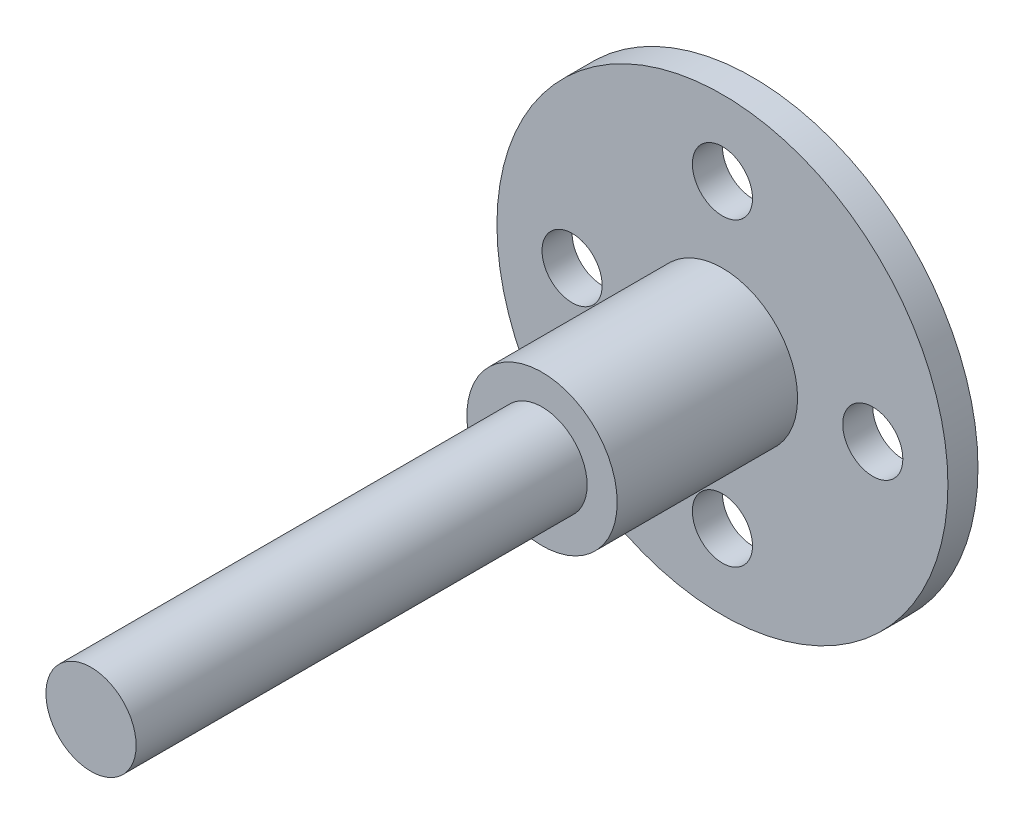
ISO-10303-21;
HEADER;
FILE_DESCRIPTION(('STEP AP214'),'2;1');
FILE_NAME('part.step','',(''),(''),'','','');
FILE_SCHEMA(('AUTOMOTIVE_DESIGN { 1 0 10303 214 1 1 1 1 }'));
ENDSEC;
DATA;
#1=APPLICATION_CONTEXT('core data for automotive mechanical design processes');
#2=APPLICATION_PROTOCOL_DEFINITION('international standard','automotive_design',2000,#1);
#3=PRODUCT_CONTEXT('',#1,'mechanical');
#4=PRODUCT('Part','Part','',(#3));
#5=PRODUCT_RELATED_PRODUCT_CATEGORY('part','',(#4));
#6=PRODUCT_DEFINITION_FORMATION('','',#4);
#7=PRODUCT_DEFINITION_CONTEXT('part definition',#1,'design');
#8=PRODUCT_DEFINITION('design','',#6,#7);
#9=PRODUCT_DEFINITION_SHAPE('','',#8);
#10=(LENGTH_UNIT() NAMED_UNIT(*) SI_UNIT(.MILLI.,.METRE.));
#11=(NAMED_UNIT(*) PLANE_ANGLE_UNIT() SI_UNIT($,.RADIAN.));
#12=(NAMED_UNIT(*) SI_UNIT($,.STERADIAN.) SOLID_ANGLE_UNIT());
#13=UNCERTAINTY_MEASURE_WITH_UNIT(LENGTH_MEASURE(1.E-05),#10,'distance_accuracy_value','');
#14=(GEOMETRIC_REPRESENTATION_CONTEXT(3) GLOBAL_UNCERTAINTY_ASSIGNED_CONTEXT((#13)) GLOBAL_UNIT_ASSIGNED_CONTEXT((#10,
#11,#12)) REPRESENTATION_CONTEXT('',''));
#15=CARTESIAN_POINT('',(0.,0.,0.));
#16=DIRECTION('',(0.,0.,1.));
#17=DIRECTION('',(1.,0.,0.));
#18=AXIS2_PLACEMENT_3D('',#15,#16,#17);
#19=CARTESIAN_POINT('',(0.,0.,2.));
#20=DIRECTION('',(0.,0.,-1.));
#21=DIRECTION('',(-1.,0.,0.));
#22=AXIS2_PLACEMENT_3D('',#19,#20,#21);
#23=CYLINDRICAL_SURFACE('',#22,15.);
#24=CARTESIAN_POINT('',(0.,0.,2.));
#25=DIRECTION('',(0.,0.,1.));
#26=DIRECTION('',(1.,0.,0.));
#27=AXIS2_PLACEMENT_3D('',#24,#25,#26);
#28=CIRCLE('',#27,15.);
#29=CARTESIAN_POINT('',(15.,0.,2.));
#30=VERTEX_POINT('',#29);
#31=EDGE_CURVE('E10',#30,#30,#28,.T.);
#32=ORIENTED_EDGE('',*,*,#31,.F.);
#33=EDGE_LOOP('',(#32));
#34=FACE_BOUND('',#33,.T.);
#35=CARTESIAN_POINT('',(0.,0.,0.));
#36=DIRECTION('',(0.,0.,1.));
#37=DIRECTION('',(1.,0.,0.));
#38=AXIS2_PLACEMENT_3D('',#35,#36,#37);
#39=CIRCLE('',#38,15.);
#40=CARTESIAN_POINT('',(15.,0.,0.));
#41=VERTEX_POINT('',#40);
#42=EDGE_CURVE('E38',#41,#41,#39,.T.);
#43=ORIENTED_EDGE('',*,*,#42,.T.);
#44=EDGE_LOOP('',(#43));
#45=FACE_BOUND('',#44,.T.);
#46=ADVANCED_FACE('F31',(#34,#45),#23,.T.);
#47=CARTESIAN_POINT('',(0.,0.,2.));
#48=DIRECTION('',(0.,0.,1.));
#49=DIRECTION('',(1.,0.,0.));
#50=AXIS2_PLACEMENT_3D('',#47,#48,#49);
#51=PLANE('',#50);
#52=CARTESIAN_POINT('',(10.0000000000003,2.82992447504893E-13,2.));
#53=DIRECTION('',(0.,0.,1.));
#54=DIRECTION('',(1.,0.,0.));
#55=AXIS2_PLACEMENT_3D('',#52,#53,#54);
#56=CIRCLE('',#55,2.00000000000022);
#57=CARTESIAN_POINT('',(12.0000000000005,2.82992447504893E-13,2.));
#58=VERTEX_POINT('',#57);
#59=EDGE_CURVE('E56',#58,#58,#56,.T.);
#60=ORIENTED_EDGE('',*,*,#59,.F.);
#61=EDGE_LOOP('',(#60));
#62=FACE_BOUND('',#61,.T.);
#63=CARTESIAN_POINT('',(5.65984895009786E-13,-10.,2.));
#64=DIRECTION('',(0.,0.,1.));
#65=DIRECTION('',(1.,0.,0.));
#66=AXIS2_PLACEMENT_3D('',#63,#64,#65);
#67=CIRCLE('',#66,2.00000000000061);
#68=CARTESIAN_POINT('',(2.00000000000117,-10.,2.));
#69=VERTEX_POINT('',#68);
#70=EDGE_CURVE('E128',#69,#69,#67,.T.);
#71=ORIENTED_EDGE('',*,*,#70,.F.);
#72=EDGE_LOOP('',(#71));
#73=FACE_BOUND('',#72,.T.);
#74=CARTESIAN_POINT('',(-9.99999999999972,-2.8421709430404E-13,2.));
#75=DIRECTION('',(0.,0.,1.));
#76=DIRECTION('',(1.,0.,0.));
#77=AXIS2_PLACEMENT_3D('',#74,#75,#76);
#78=CIRCLE('',#77,2.00000000000045);
#79=CARTESIAN_POINT('',(-7.99999999999926,-2.8421709430404E-13,2.));
#80=VERTEX_POINT('',#79);
#81=EDGE_CURVE('E68',#80,#80,#78,.T.);
#82=ORIENTED_EDGE('',*,*,#81,.F.);
#83=EDGE_LOOP('',(#82));
#84=FACE_BOUND('',#83,.T.);
#85=CARTESIAN_POINT('',(0.,10.,2.));
#86=DIRECTION('',(0.,0.,1.));
#87=DIRECTION('',(1.,0.,0.));
#88=AXIS2_PLACEMENT_3D('',#85,#86,#87);
#89=CIRCLE('',#88,2.);
#90=CARTESIAN_POINT('',(2.,10.,2.));
#91=VERTEX_POINT('',#90);
#92=EDGE_CURVE('E52',#91,#91,#89,.T.);
#93=ORIENTED_EDGE('',*,*,#92,.F.);
#94=EDGE_LOOP('',(#93));
#95=FACE_BOUND('',#94,.T.);
#96=CARTESIAN_POINT('',(0.,0.,2.));
#97=DIRECTION('',(0.,0.,1.));
#98=DIRECTION('',(1.,0.,0.));
#99=AXIS2_PLACEMENT_3D('',#96,#97,#98);
#100=CIRCLE('',#99,5.);
#101=CARTESIAN_POINT('',(5.,0.,2.));
#102=VERTEX_POINT('',#101);
#103=EDGE_CURVE('E46',#102,#102,#100,.T.);
#104=ORIENTED_EDGE('',*,*,#103,.F.);
#105=EDGE_LOOP('',(#104));
#106=FACE_BOUND('',#105,.T.);
#107=ORIENTED_EDGE('',*,*,#31,.T.);
#108=EDGE_LOOP('',(#107));
#109=FACE_BOUND('',#108,.T.);
#110=ADVANCED_FACE('F78',(#62,#73,#84,#95,#106,#109),#51,.T.);
#111=CARTESIAN_POINT('',(0.,0.,0.));
#112=DIRECTION('',(0.,0.,1.));
#113=DIRECTION('',(1.,0.,0.));
#114=AXIS2_PLACEMENT_3D('',#111,#112,#113);
#115=PLANE('',#114);
#116=CARTESIAN_POINT('',(10.0000000000003,2.82992447504893E-13,0.));
#117=DIRECTION('',(0.,0.,1.));
#118=DIRECTION('',(1.,0.,0.));
#119=AXIS2_PLACEMENT_3D('',#116,#117,#118);
#120=CIRCLE('',#119,2.00000000000022);
#121=CARTESIAN_POINT('',(12.0000000000005,2.82992447504893E-13,0.));
#122=VERTEX_POINT('',#121);
#123=EDGE_CURVE('E34',#122,#122,#120,.T.);
#124=ORIENTED_EDGE('',*,*,#123,.T.);
#125=EDGE_LOOP('',(#124));
#126=FACE_BOUND('',#125,.T.);
#127=CARTESIAN_POINT('',(5.65984895009786E-13,-10.,0.));
#128=DIRECTION('',(0.,0.,1.));
#129=DIRECTION('',(1.,0.,0.));
#130=AXIS2_PLACEMENT_3D('',#127,#128,#129);
#131=CIRCLE('',#130,2.00000000000061);
#132=CARTESIAN_POINT('',(2.00000000000117,-10.,0.));
#133=VERTEX_POINT('',#132);
#134=EDGE_CURVE('E55',#133,#133,#131,.T.);
#135=ORIENTED_EDGE('',*,*,#134,.T.);
#136=EDGE_LOOP('',(#135));
#137=FACE_BOUND('',#136,.T.);
#138=CARTESIAN_POINT('',(-9.99999999999972,-2.8421709430404E-13,0.));
#139=DIRECTION('',(0.,0.,1.));
#140=DIRECTION('',(1.,0.,0.));
#141=AXIS2_PLACEMENT_3D('',#138,#139,#140);
#142=CIRCLE('',#141,2.00000000000045);
#143=CARTESIAN_POINT('',(-7.99999999999926,-2.8421709430404E-13,0.));
#144=VERTEX_POINT('',#143);
#145=EDGE_CURVE('E53',#144,#144,#142,.T.);
#146=ORIENTED_EDGE('',*,*,#145,.T.);
#147=EDGE_LOOP('',(#146));
#148=FACE_BOUND('',#147,.T.);
#149=CARTESIAN_POINT('',(0.,10.,0.));
#150=DIRECTION('',(0.,0.,1.));
#151=DIRECTION('',(1.,0.,0.));
#152=AXIS2_PLACEMENT_3D('',#149,#150,#151);
#153=CIRCLE('',#152,2.);
#154=CARTESIAN_POINT('',(2.,10.,0.));
#155=VERTEX_POINT('',#154);
#156=EDGE_CURVE('E49',#155,#155,#153,.T.);
#157=ORIENTED_EDGE('',*,*,#156,.T.);
#158=EDGE_LOOP('',(#157));
#159=FACE_BOUND('',#158,.T.);
#160=ORIENTED_EDGE('',*,*,#42,.F.);
#161=EDGE_LOOP('',(#160));
#162=FACE_BOUND('',#161,.T.);
#163=ADVANCED_FACE('F80',(#126,#137,#148,#159,#162),#115,.F.);
#164=CARTESIAN_POINT('',(0.,0.,14.));
#165=DIRECTION('',(0.,0.,-1.));
#166=DIRECTION('',(-1.,0.,0.));
#167=AXIS2_PLACEMENT_3D('',#164,#165,#166);
#168=CYLINDRICAL_SURFACE('',#167,5.);
#169=CARTESIAN_POINT('',(0.,0.,14.));
#170=DIRECTION('',(0.,0.,1.));
#171=DIRECTION('',(1.,0.,0.));
#172=AXIS2_PLACEMENT_3D('',#169,#170,#171);
#173=CIRCLE('',#172,5.);
#174=CARTESIAN_POINT('',(5.,0.,14.));
#175=VERTEX_POINT('',#174);
#176=EDGE_CURVE('E43',#175,#175,#173,.T.);
#177=ORIENTED_EDGE('',*,*,#176,.F.);
#178=EDGE_LOOP('',(#177));
#179=FACE_BOUND('',#178,.T.);
#180=ORIENTED_EDGE('',*,*,#103,.T.);
#181=EDGE_LOOP('',(#180));
#182=FACE_BOUND('',#181,.T.);
#183=ADVANCED_FACE('F76',(#179,#182),#168,.T.);
#184=CARTESIAN_POINT('',(0.,0.,14.));
#185=DIRECTION('',(0.,0.,1.));
#186=DIRECTION('',(1.,0.,0.));
#187=AXIS2_PLACEMENT_3D('',#184,#185,#186);
#188=PLANE('',#187);
#189=CARTESIAN_POINT('',(0.,0.,14.));
#190=DIRECTION('',(0.,0.,1.));
#191=DIRECTION('',(1.,0.,0.));
#192=AXIS2_PLACEMENT_3D('',#189,#190,#191);
#193=CIRCLE('',#192,3.);
#194=CARTESIAN_POINT('',(3.,0.,14.));
#195=VERTEX_POINT('',#194);
#196=EDGE_CURVE('E125',#195,#195,#193,.T.);
#197=ORIENTED_EDGE('',*,*,#196,.F.);
#198=EDGE_LOOP('',(#197));
#199=FACE_BOUND('',#198,.T.);
#200=ORIENTED_EDGE('',*,*,#176,.T.);
#201=EDGE_LOOP('',(#200));
#202=FACE_BOUND('',#201,.T.);
#203=ADVANCED_FACE('F93',(#199,#202),#188,.T.);
#204=CARTESIAN_POINT('',(0.,10.,-4.));
#205=DIRECTION('',(0.,0.,1.));
#206=DIRECTION('',(1.,0.,0.));
#207=AXIS2_PLACEMENT_3D('',#204,#205,#206);
#208=CYLINDRICAL_SURFACE('',#207,2.);
#209=ORIENTED_EDGE('',*,*,#92,.T.);
#210=EDGE_LOOP('',(#209));
#211=FACE_BOUND('',#210,.T.);
#212=ORIENTED_EDGE('',*,*,#156,.F.);
#213=EDGE_LOOP('',(#212));
#214=FACE_BOUND('',#213,.T.);
#215=ADVANCED_FACE('F97',(#211,#214),#208,.F.);
#216=CARTESIAN_POINT('',(-9.99999999999972,-2.8421709430404E-13,-4.));
#217=DIRECTION('',(0.,0.,1.));
#218=DIRECTION('',(1.,0.,0.));
#219=AXIS2_PLACEMENT_3D('',#216,#217,#218);
#220=CYLINDRICAL_SURFACE('',#219,2.00000000000045);
#221=ORIENTED_EDGE('',*,*,#81,.T.);
#222=EDGE_LOOP('',(#221));
#223=FACE_BOUND('',#222,.T.);
#224=ORIENTED_EDGE('',*,*,#145,.F.);
#225=EDGE_LOOP('',(#224));
#226=FACE_BOUND('',#225,.T.);
#227=ADVANCED_FACE('F101',(#223,#226),#220,.F.);
#228=CARTESIAN_POINT('',(5.65984895009786E-13,-10.,-4.));
#229=DIRECTION('',(0.,0.,1.));
#230=DIRECTION('',(1.,0.,0.));
#231=AXIS2_PLACEMENT_3D('',#228,#229,#230);
#232=CYLINDRICAL_SURFACE('',#231,2.00000000000061);
#233=ORIENTED_EDGE('',*,*,#70,.T.);
#234=EDGE_LOOP('',(#233));
#235=FACE_BOUND('',#234,.T.);
#236=ORIENTED_EDGE('',*,*,#134,.F.);
#237=EDGE_LOOP('',(#236));
#238=FACE_BOUND('',#237,.T.);
#239=ADVANCED_FACE('F104',(#235,#238),#232,.F.);
#240=CARTESIAN_POINT('',(10.0000000000003,2.82992447504893E-13,-4.));
#241=DIRECTION('',(0.,0.,1.));
#242=DIRECTION('',(1.,0.,0.));
#243=AXIS2_PLACEMENT_3D('',#240,#241,#242);
#244=CYLINDRICAL_SURFACE('',#243,2.00000000000022);
#245=ORIENTED_EDGE('',*,*,#59,.T.);
#246=EDGE_LOOP('',(#245));
#247=FACE_BOUND('',#246,.T.);
#248=ORIENTED_EDGE('',*,*,#123,.F.);
#249=EDGE_LOOP('',(#248));
#250=FACE_BOUND('',#249,.T.);
#251=ADVANCED_FACE('F108',(#247,#250),#244,.F.);
#252=CARTESIAN_POINT('',(0.,0.,44.));
#253=DIRECTION('',(0.,0.,-1.));
#254=DIRECTION('',(-1.,0.,0.));
#255=AXIS2_PLACEMENT_3D('',#252,#253,#254);
#256=CYLINDRICAL_SURFACE('',#255,3.);
#257=CARTESIAN_POINT('',(0.,0.,44.));
#258=DIRECTION('',(0.,0.,1.));
#259=DIRECTION('',(1.,0.,0.));
#260=AXIS2_PLACEMENT_3D('',#257,#258,#259);
#261=CIRCLE('',#260,3.);
#262=CARTESIAN_POINT('',(3.,0.,44.));
#263=VERTEX_POINT('',#262);
#264=EDGE_CURVE('E124',#263,#263,#261,.T.);
#265=ORIENTED_EDGE('',*,*,#264,.F.);
#266=EDGE_LOOP('',(#265));
#267=FACE_BOUND('',#266,.T.);
#268=ORIENTED_EDGE('',*,*,#196,.T.);
#269=EDGE_LOOP('',(#268));
#270=FACE_BOUND('',#269,.T.);
#271=ADVANCED_FACE('F112',(#267,#270),#256,.T.);
#272=CARTESIAN_POINT('',(0.,0.,44.));
#273=DIRECTION('',(0.,0.,1.));
#274=DIRECTION('',(1.,0.,0.));
#275=AXIS2_PLACEMENT_3D('',#272,#273,#274);
#276=PLANE('',#275);
#277=ORIENTED_EDGE('',*,*,#264,.T.);
#278=EDGE_LOOP('',(#277));
#279=FACE_BOUND('',#278,.T.);
#280=ADVANCED_FACE('F116',(#279),#276,.T.);
#281=CLOSED_SHELL('',(#46,#110,#163,#183,#203,#215,#227,#239,#251,#271,#280));
#282=MANIFOLD_SOLID_BREP('B2',#281);
#283=ADVANCED_BREP_SHAPE_REPRESENTATION('',(#18,#282),#14);
#284=SHAPE_DEFINITION_REPRESENTATION(#9,#283);
ENDSEC;
END-ISO-10303-21;
